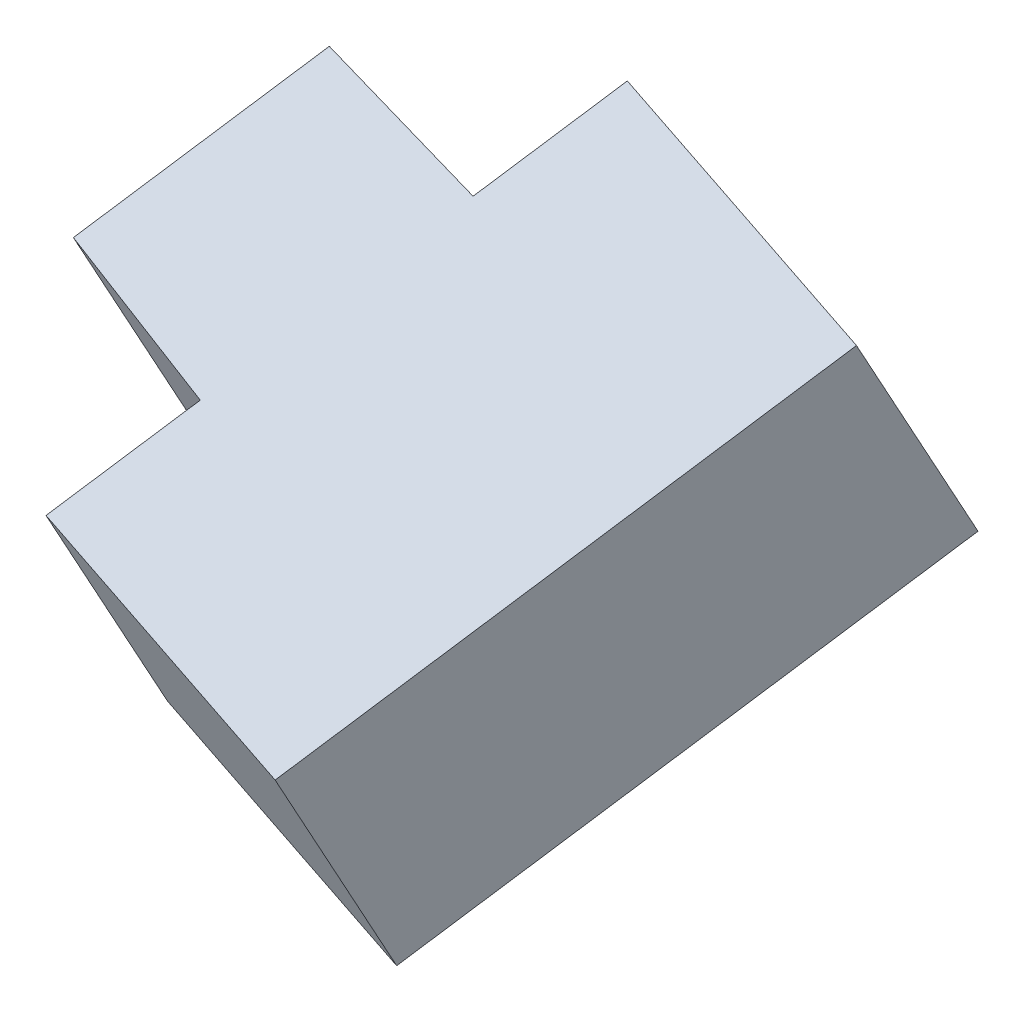
ISO-10303-21;
HEADER;
FILE_DESCRIPTION(('STEP AP214'),'2;1');
FILE_NAME('part.step','',(''),(''),'','','');
FILE_SCHEMA(('AUTOMOTIVE_DESIGN { 1 0 10303 214 1 1 1 1 }'));
ENDSEC;
DATA;
#1=APPLICATION_CONTEXT('core data for automotive mechanical design processes');
#2=APPLICATION_PROTOCOL_DEFINITION('international standard','automotive_design',2000,#1);
#3=PRODUCT_CONTEXT('',#1,'mechanical');
#4=PRODUCT('Part','Part','',(#3));
#5=PRODUCT_RELATED_PRODUCT_CATEGORY('part','',(#4));
#6=PRODUCT_DEFINITION_FORMATION('','',#4);
#7=PRODUCT_DEFINITION_CONTEXT('part definition',#1,'design');
#8=PRODUCT_DEFINITION('design','',#6,#7);
#9=PRODUCT_DEFINITION_SHAPE('','',#8);
#10=(LENGTH_UNIT() NAMED_UNIT(*) SI_UNIT(.MILLI.,.METRE.));
#11=(NAMED_UNIT(*) PLANE_ANGLE_UNIT() SI_UNIT($,.RADIAN.));
#12=(NAMED_UNIT(*) SI_UNIT($,.STERADIAN.) SOLID_ANGLE_UNIT());
#13=UNCERTAINTY_MEASURE_WITH_UNIT(LENGTH_MEASURE(1.E-05),#10,'distance_accuracy_value','');
#14=(GEOMETRIC_REPRESENTATION_CONTEXT(3) GLOBAL_UNCERTAINTY_ASSIGNED_CONTEXT((#13)) GLOBAL_UNIT_ASSIGNED_CONTEXT((#10,
#11,#12)) REPRESENTATION_CONTEXT('',''));
#15=CARTESIAN_POINT('',(0.,0.,0.));
#16=DIRECTION('',(0.,0.,1.));
#17=DIRECTION('',(1.,0.,0.));
#18=AXIS2_PLACEMENT_3D('',#15,#16,#17);
#19=CARTESIAN_POINT('',(-24.55919831002,264.954932613117,-56.2331651011142));
#20=DIRECTION('',(-0.948683298050514,0.,-0.316227766016838));
#21=DIRECTION('',(-0.316227766016838,0.,0.948683298050514));
#22=AXIS2_PLACEMENT_3D('',#19,#20,#21);
#23=PLANE('',#22);
#24=DIRECTION('',(0.282555355269368,0.449026404664588,-0.847666065808107));
#25=VECTOR('',#24,1.);
#26=CARTESIAN_POINT('',(-23.707230609042,259.593821686741,-58.789068204048));
#27=LINE('',#26,#25);
#28=CARTESIAN_POINT('',(-27.7825891063188,253.117414357611,-46.5629927122176));
#29=VERTEX_POINT('',#28);
#30=CARTESIAN_POINT('',(-23.707230609042,259.593821686741,-58.789068204048));
#31=VERTEX_POINT('',#30);
#32=EDGE_CURVE('E140',#29,#31,#27,.T.);
#33=ORIENTED_EDGE('',*,*,#32,.T.);
#34=DIRECTION('',(0.141994616829656,-0.893518487729266,-0.425983850488964));
#35=VECTOR('',#34,1.);
#36=CARTESIAN_POINT('',(-24.55919831002,264.954932613117,-56.2331651011142));
#37=LINE('',#36,#35);
#38=CARTESIAN_POINT('',(-24.55919831002,264.954932613117,-56.2331651011142));
#39=VERTEX_POINT('',#38);
#40=EDGE_CURVE('E11',#39,#31,#37,.T.);
#41=ORIENTED_EDGE('',*,*,#40,.F.);
#42=DIRECTION('',(0.282555355269368,0.449026404664588,-0.847666065808107));
#43=VECTOR('',#42,1.);
#44=CARTESIAN_POINT('',(-24.55919831002,264.954932613117,-56.2331651011142));
#45=LINE('',#44,#43);
#46=CARTESIAN_POINT('',(-28.6345568072968,258.478525283987,-44.0070896092838));
#47=VERTEX_POINT('',#46);
#48=EDGE_CURVE('E162',#47,#39,#45,.T.);
#49=ORIENTED_EDGE('',*,*,#48,.F.);
#50=DIRECTION('',(0.141994616829656,-0.893518487729266,-0.425983850488964));
#51=VECTOR('',#50,1.);
#52=CARTESIAN_POINT('',(-28.6345568072968,258.478525283987,-44.0070896092838));
#53=LINE('',#52,#51);
#54=EDGE_CURVE('E136',#47,#29,#53,.T.);
#55=ORIENTED_EDGE('',*,*,#54,.T.);
#56=EDGE_LOOP('',(#33,#41,#49,#55));
#57=FACE_BOUND('',#56,.T.);
#58=ADVANCED_FACE('F39',(#57),#23,.F.);
#59=CARTESIAN_POINT('',(-34.1978206182132,264.954932613117,-59.4460392038453));
#60=DIRECTION('',(-0.282555355269369,-0.449026404664586,0.847666065808108));
#61=DIRECTION('',(0.,-0.88367494046767,-0.468101057026642));
#62=AXIS2_PLACEMENT_3D('',#59,#60,#61);
#63=PLANE('',#62);
#64=DIRECTION('',(-0.948683298050514,0.,-0.316227766016838));
#65=VECTOR('',#64,1.);
#66=CARTESIAN_POINT('',(-33.3458529172353,259.593821686741,-62.0019423067791));
#67=LINE('',#66,#65);
#68=CARTESIAN_POINT('',(-33.3458529172353,259.593821686741,-62.0019423067791));
#69=VERTEX_POINT('',#68);
#70=EDGE_CURVE('E144',#31,#69,#67,.T.);
#71=ORIENTED_EDGE('',*,*,#70,.T.);
#72=DIRECTION('',(0.141994616829656,-0.893518487729266,-0.425983850488964));
#73=VECTOR('',#72,1.);
#74=CARTESIAN_POINT('',(-34.1978206182132,264.954932613117,-59.4460392038453));
#75=LINE('',#74,#73);
#76=CARTESIAN_POINT('',(-34.1978206182132,264.954932613117,-59.4460392038453));
#77=VERTEX_POINT('',#76);
#78=EDGE_CURVE('E48',#77,#69,#75,.T.);
#79=ORIENTED_EDGE('',*,*,#78,.F.);
#80=DIRECTION('',(-0.948683298050513,0.,-0.316227766016841));
#81=VECTOR('',#80,1.);
#82=CARTESIAN_POINT('',(-26.2705040674265,264.954932613117,-56.8036003535831));
#83=LINE('',#82,#81);
#84=EDGE_CURVE('E99',#39,#77,#83,.T.);
#85=ORIENTED_EDGE('',*,*,#84,.F.);
#86=ORIENTED_EDGE('',*,*,#40,.T.);
#87=EDGE_LOOP('',(#71,#79,#85,#86));
#88=FACE_BOUND('',#87,.T.);
#89=ADVANCED_FACE('F208',(#88),#63,.F.);
#90=CARTESIAN_POINT('',(-35.2791843112913,263.2364698688,-56.2019481246111));
#91=DIRECTION('',(0.948683298050514,0.,0.316227766016836));
#92=DIRECTION('',(0.316227766016836,0.,-0.948683298050514));
#93=AXIS2_PLACEMENT_3D('',#90,#91,#92);
#94=PLANE('',#93);
#95=DIRECTION('',(-0.282555355269367,-0.44902640466459,0.847666065808107));
#96=VECTOR('',#95,1.);
#97=CARTESIAN_POINT('',(-34.4272166103133,257.875358942424,-58.7578512275448));
#98=LINE('',#97,#96);
#99=CARTESIAN_POINT('',(-34.4272166103133,257.875358942424,-58.7578512275448));
#100=VERTEX_POINT('',#99);
#101=EDGE_CURVE('E147',#69,#100,#98,.T.);
#102=ORIENTED_EDGE('',*,*,#101,.T.);
#103=DIRECTION('',(0.141994616829656,-0.893518487729266,-0.425983850488964));
#104=VECTOR('',#103,1.);
#105=CARTESIAN_POINT('',(-35.2791843112913,263.2364698688,-56.2019481246111));
#106=LINE('',#105,#104);
#107=CARTESIAN_POINT('',(-35.2791843112913,263.2364698688,-56.2019481246111));
#108=VERTEX_POINT('',#107);
#109=EDGE_CURVE('E173',#108,#100,#106,.T.);
#110=ORIENTED_EDGE('',*,*,#109,.F.);
#111=DIRECTION('',(-0.282555355269367,-0.44902640466459,0.847666065808107));
#112=VECTOR('',#111,1.);
#113=CARTESIAN_POINT('',(-35.2791843112913,263.2364698688,-56.2019481246111));
#114=LINE('',#113,#112);
#115=EDGE_CURVE('E183',#77,#108,#114,.T.);
#116=ORIENTED_EDGE('',*,*,#115,.F.);
#117=ORIENTED_EDGE('',*,*,#78,.T.);
#118=EDGE_LOOP('',(#102,#110,#116,#117));
#119=FACE_BOUND('',#118,.T.);
#120=ADVANCED_FACE('F181',(#119),#94,.F.);
#121=CARTESIAN_POINT('',(-41.0304864021741,263.142387783362,-57.9217078129717));
#122=DIRECTION('',(-0.249274660549307,-0.448752869911152,0.858185880421329));
#123=DIRECTION('',(0.,-0.886159426893028,-0.463380480953418));
#124=AXIS2_PLACEMENT_3D('',#121,#122,#123);
#125=PLANE('',#124);
#126=DIRECTION('',(-0.957966425507401,-0.0156707955289259,-0.286452009537486));
#127=VECTOR('',#126,1.);
#128=CARTESIAN_POINT('',(-40.1785187011962,257.781276856986,-60.4776109159054));
#129=LINE('',#128,#127);
#130=CARTESIAN_POINT('',(-40.1785187011962,257.781276856986,-60.4776109159054));
#131=VERTEX_POINT('',#130);
#132=EDGE_CURVE('E150',#100,#131,#129,.T.);
#133=ORIENTED_EDGE('',*,*,#132,.T.);
#134=DIRECTION('',(0.141994616829656,-0.893518487729266,-0.425983850488964));
#135=VECTOR('',#134,1.);
#136=CARTESIAN_POINT('',(-41.0304864021741,263.142387783362,-57.9217078129717));
#137=LINE('',#136,#135);
#138=CARTESIAN_POINT('',(-41.0304864021741,263.142387783362,-57.9217078129717));
#139=VERTEX_POINT('',#138);
#140=EDGE_CURVE('E169',#139,#131,#137,.T.);
#141=ORIENTED_EDGE('',*,*,#140,.F.);
#142=DIRECTION('',(-0.957966425507401,-0.0156707955289259,-0.286452009537486));
#143=VECTOR('',#142,1.);
#144=CARTESIAN_POINT('',(-41.0304864021741,263.142387783362,-57.9217078129717));
#145=LINE('',#144,#143);
#146=EDGE_CURVE('E196',#108,#139,#145,.T.);
#147=ORIENTED_EDGE('',*,*,#146,.F.);
#148=ORIENTED_EDGE('',*,*,#109,.T.);
#149=EDGE_LOOP('',(#133,#141,#147,#148));
#150=FACE_BOUND('',#149,.T.);
#151=ADVANCED_FACE('F191',(#150),#125,.F.);
#152=CARTESIAN_POINT('',(-42.8247129081345,260.291070113742,-52.5390282950903));
#153=DIRECTION('',(0.948683298050514,0.,0.316227766016838));
#154=DIRECTION('',(0.316227766016838,0.,-0.948683298050514));
#155=AXIS2_PLACEMENT_3D('',#152,#153,#154);
#156=PLANE('',#155);
#157=DIRECTION('',(-0.282555355269368,-0.449026404664588,0.847666065808108));
#158=VECTOR('',#157,1.);
#159=CARTESIAN_POINT('',(-41.9727452071566,254.929959187366,-55.0949313980241));
#160=LINE('',#159,#158);
#161=CARTESIAN_POINT('',(-41.9727452071566,254.929959187366,-55.0949313980241));
#162=VERTEX_POINT('',#161);
#163=EDGE_CURVE('E153',#131,#162,#160,.T.);
#164=ORIENTED_EDGE('',*,*,#163,.T.);
#165=DIRECTION('',(0.141994616829656,-0.893518487729266,-0.425983850488964));
#166=VECTOR('',#165,1.);
#167=CARTESIAN_POINT('',(-42.8247129081345,260.291070113742,-52.5390282950903));
#168=LINE('',#167,#166);
#169=CARTESIAN_POINT('',(-42.8247129081345,260.291070113742,-52.5390282950903));
#170=VERTEX_POINT('',#169);
#171=EDGE_CURVE('E129',#170,#162,#168,.T.);
#172=ORIENTED_EDGE('',*,*,#171,.F.);
#173=DIRECTION('',(-0.282555355269368,-0.449026404664588,0.847666065808108));
#174=VECTOR('',#173,1.);
#175=CARTESIAN_POINT('',(-42.8247129081345,260.291070113742,-52.5390282950903));
#176=LINE('',#175,#174);
#177=EDGE_CURVE('E118',#139,#170,#176,.T.);
#178=ORIENTED_EDGE('',*,*,#177,.F.);
#179=ORIENTED_EDGE('',*,*,#140,.T.);
#180=EDGE_LOOP('',(#164,#172,#178,#179));
#181=FACE_BOUND('',#180,.T.);
#182=ADVANCED_FACE('F194',(#181),#156,.F.);
#183=CARTESIAN_POINT('',(-37.1918154224119,260.196988028304,-50.4640547912491));
#184=DIRECTION('',(0.315491799813351,0.448752869911152,-0.836113500666648));
#185=DIRECTION('',(0.,0.881113460327662,0.472904927051319));
#186=AXIS2_PLACEMENT_3D('',#183,#184,#185);
#187=PLANE('',#186);
#188=DIRECTION('',(0.938244346128411,-0.0156707955289167,0.345618247674455));
#189=VECTOR('',#188,1.);
#190=CARTESIAN_POINT('',(-36.339847721434,254.835877101928,-53.0199578941829));
#191=LINE('',#190,#189);
#192=CARTESIAN_POINT('',(-36.339847721434,254.835877101928,-53.0199578941829));
#193=VERTEX_POINT('',#192);
#194=EDGE_CURVE('E127',#162,#193,#191,.T.);
#195=ORIENTED_EDGE('',*,*,#194,.T.);
#196=DIRECTION('',(0.141994616829656,-0.893518487729266,-0.425983850488964));
#197=VECTOR('',#196,1.);
#198=CARTESIAN_POINT('',(-37.1918154224119,260.196988028304,-50.4640547912491));
#199=LINE('',#198,#197);
#200=CARTESIAN_POINT('',(-37.1918154224119,260.196988028304,-50.4640547912491));
#201=VERTEX_POINT('',#200);
#202=EDGE_CURVE('E124',#201,#193,#199,.T.);
#203=ORIENTED_EDGE('',*,*,#202,.F.);
#204=DIRECTION('',(0.938244346128411,-0.0156707955289167,0.345618247674455));
#205=VECTOR('',#204,1.);
#206=CARTESIAN_POINT('',(-37.1918154224119,260.196988028304,-50.4640547912491));
#207=LINE('',#206,#205);
#208=EDGE_CURVE('E112',#170,#201,#207,.T.);
#209=ORIENTED_EDGE('',*,*,#208,.F.);
#210=ORIENTED_EDGE('',*,*,#171,.T.);
#211=EDGE_LOOP('',(#195,#203,#209,#210));
#212=FACE_BOUND('',#211,.T.);
#213=ADVANCED_FACE('F125',(#212),#187,.F.);
#214=CARTESIAN_POINT('',(-38.27317911549,258.478525283987,-47.2199637120149));
#215=DIRECTION('',(0.948683298050514,0.,0.316227766016837));
#216=DIRECTION('',(0.316227766016837,0.,-0.948683298050514));
#217=AXIS2_PLACEMENT_3D('',#214,#215,#216);
#218=PLANE('',#217);
#219=DIRECTION('',(-0.282555355269367,-0.449026404664593,0.847666065808105));
#220=VECTOR('',#219,1.);
#221=CARTESIAN_POINT('',(-37.421211414512,253.117414357611,-49.7758668149487));
#222=LINE('',#221,#220);
#223=CARTESIAN_POINT('',(-37.421211414512,253.117414357611,-49.7758668149487));
#224=VERTEX_POINT('',#223);
#225=EDGE_CURVE('E85',#193,#224,#222,.T.);
#226=ORIENTED_EDGE('',*,*,#225,.T.);
#227=DIRECTION('',(0.141994616829656,-0.893518487729266,-0.425983850488964));
#228=VECTOR('',#227,1.);
#229=CARTESIAN_POINT('',(-38.27317911549,258.478525283987,-47.2199637120149));
#230=LINE('',#229,#228);
#231=CARTESIAN_POINT('',(-38.27317911549,258.478525283987,-47.2199637120149));
#232=VERTEX_POINT('',#231);
#233=EDGE_CURVE('E130',#232,#224,#230,.T.);
#234=ORIENTED_EDGE('',*,*,#233,.F.);
#235=DIRECTION('',(-0.282555355269367,-0.449026404664593,0.847666065808105));
#236=VECTOR('',#235,1.);
#237=CARTESIAN_POINT('',(-38.27317911549,258.478525283987,-47.2199637120149));
#238=LINE('',#237,#236);
#239=EDGE_CURVE('E116',#201,#232,#238,.T.);
#240=ORIENTED_EDGE('',*,*,#239,.F.);
#241=ORIENTED_EDGE('',*,*,#202,.T.);
#242=EDGE_LOOP('',(#226,#234,#240,#241));
#243=FACE_BOUND('',#242,.T.);
#244=ADVANCED_FACE('F132',(#243),#218,.F.);
#245=CARTESIAN_POINT('',(-28.6345568072968,258.478525283987,-44.0070896092838));
#246=DIRECTION('',(0.28255535526937,0.449026404664586,-0.847666065808108));
#247=DIRECTION('',(0.,0.88367494046767,0.468101057026642));
#248=AXIS2_PLACEMENT_3D('',#245,#246,#247);
#249=PLANE('',#248);
#250=DIRECTION('',(0.948683298050514,0.,0.316227766016838));
#251=VECTOR('',#250,1.);
#252=CARTESIAN_POINT('',(-27.7825891063188,253.117414357611,-46.5629927122176));
#253=LINE('',#252,#251);
#254=EDGE_CURVE('E91',#224,#29,#253,.T.);
#255=ORIENTED_EDGE('',*,*,#254,.T.);
#256=ORIENTED_EDGE('',*,*,#54,.F.);
#257=DIRECTION('',(0.948683298050514,0.,0.316227766016838));
#258=VECTOR('',#257,1.);
#259=CARTESIAN_POINT('',(-28.6345568072968,258.478525283987,-44.0070896092838));
#260=LINE('',#259,#258);
#261=EDGE_CURVE('E56',#232,#47,#260,.T.);
#262=ORIENTED_EDGE('',*,*,#261,.F.);
#263=ORIENTED_EDGE('',*,*,#233,.T.);
#264=EDGE_LOOP('',(#255,#256,#262,#263));
#265=FACE_BOUND('',#264,.T.);
#266=ADVANCED_FACE('F224',(#265),#249,.F.);
#267=CARTESIAN_POINT('',(-30.7098835487489,193.245697051588,92.1296506462466));
#268=DIRECTION('',(0.141994616829656,-0.893518487729266,-0.425983850488966));
#269=DIRECTION('',(0.,0.430344344725873,-0.902664802106773));
#270=AXIS2_PLACEMENT_3D('',#267,#268,#269);
#271=PLANE('',#270);
#272=ORIENTED_EDGE('',*,*,#48,.T.);
#273=ORIENTED_EDGE('',*,*,#84,.T.);
#274=ORIENTED_EDGE('',*,*,#115,.T.);
#275=ORIENTED_EDGE('',*,*,#146,.T.);
#276=ORIENTED_EDGE('',*,*,#177,.T.);
#277=ORIENTED_EDGE('',*,*,#208,.T.);
#278=ORIENTED_EDGE('',*,*,#239,.T.);
#279=ORIENTED_EDGE('',*,*,#261,.T.);
#280=EDGE_LOOP('',(#272,#273,#274,#275,#276,#277,#278,#279));
#281=FACE_BOUND('',#280,.T.);
#282=ADVANCED_FACE('F114',(#281),#271,.F.);
#283=CARTESIAN_POINT('',(-29.857915847771,187.884586125213,89.5737475433128));
#284=DIRECTION('',(0.141994616829656,-0.893518487729266,-0.425983850488966));
#285=DIRECTION('',(0.,0.430344344725873,-0.902664802106773));
#286=AXIS2_PLACEMENT_3D('',#283,#284,#285);
#287=PLANE('',#286);
#288=ORIENTED_EDGE('',*,*,#32,.F.);
#289=ORIENTED_EDGE('',*,*,#254,.F.);
#290=ORIENTED_EDGE('',*,*,#225,.F.);
#291=ORIENTED_EDGE('',*,*,#194,.F.);
#292=ORIENTED_EDGE('',*,*,#163,.F.);
#293=ORIENTED_EDGE('',*,*,#132,.F.);
#294=ORIENTED_EDGE('',*,*,#101,.F.);
#295=ORIENTED_EDGE('',*,*,#70,.F.);
#296=EDGE_LOOP('',(#288,#289,#290,#291,#292,#293,#294,#295));
#297=FACE_BOUND('',#296,.T.);
#298=ADVANCED_FACE('F187',(#297),#287,.T.);
#299=CLOSED_SHELL('',(#58,#89,#120,#151,#182,#213,#244,#266,#282,#298));
#300=MANIFOLD_SOLID_BREP('B2',#299);
#301=ADVANCED_BREP_SHAPE_REPRESENTATION('',(#18,#300),#14);
#302=SHAPE_DEFINITION_REPRESENTATION(#9,#301);
ENDSEC;
END-ISO-10303-21;
